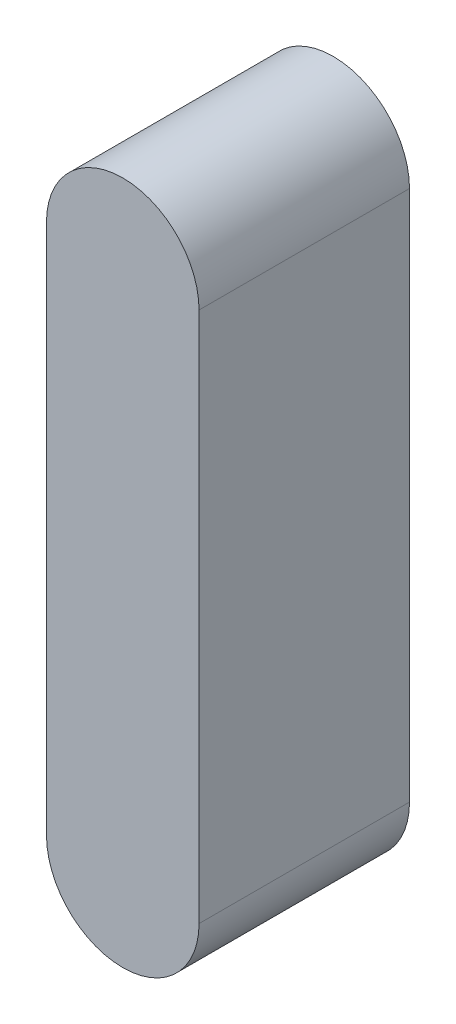
ISO-10303-21;
HEADER;
FILE_DESCRIPTION(('STEP AP214'),'2;1');
FILE_NAME('part.step','',(''),(''),'','','');
FILE_SCHEMA(('AUTOMOTIVE_DESIGN { 1 0 10303 214 1 1 1 1 }'));
ENDSEC;
DATA;
#1=APPLICATION_CONTEXT('core data for automotive mechanical design processes');
#2=APPLICATION_PROTOCOL_DEFINITION('international standard','automotive_design',2000,#1);
#3=PRODUCT_CONTEXT('',#1,'mechanical');
#4=PRODUCT('Part','Part','',(#3));
#5=PRODUCT_RELATED_PRODUCT_CATEGORY('part','',(#4));
#6=PRODUCT_DEFINITION_FORMATION('','',#4);
#7=PRODUCT_DEFINITION_CONTEXT('part definition',#1,'design');
#8=PRODUCT_DEFINITION('design','',#6,#7);
#9=PRODUCT_DEFINITION_SHAPE('','',#8);
#10=(LENGTH_UNIT() NAMED_UNIT(*) SI_UNIT(.MILLI.,.METRE.));
#11=(NAMED_UNIT(*) PLANE_ANGLE_UNIT() SI_UNIT($,.RADIAN.));
#12=(NAMED_UNIT(*) SI_UNIT($,.STERADIAN.) SOLID_ANGLE_UNIT());
#13=UNCERTAINTY_MEASURE_WITH_UNIT(LENGTH_MEASURE(1.E-05),#10,'distance_accuracy_value','');
#14=(GEOMETRIC_REPRESENTATION_CONTEXT(3) GLOBAL_UNCERTAINTY_ASSIGNED_CONTEXT((#13)) GLOBAL_UNIT_ASSIGNED_CONTEXT((#10,
#11,#12)) REPRESENTATION_CONTEXT('',''));
#15=CARTESIAN_POINT('',(0.,0.,0.));
#16=DIRECTION('',(0.,0.,1.));
#17=DIRECTION('',(1.,0.,0.));
#18=AXIS2_PLACEMENT_3D('',#15,#16,#17);
#19=CARTESIAN_POINT('',(1.45,0.,4.));
#20=DIRECTION('',(-1.,0.,0.));
#21=DIRECTION('',(0.,-1.,0.));
#22=AXIS2_PLACEMENT_3D('',#19,#20,#21);
#23=PLANE('',#22);
#24=DIRECTION('',(0.,1.,0.));
#25=VECTOR('',#24,1.);
#26=CARTESIAN_POINT('',(1.45,0.,0.));
#27=LINE('',#26,#25);
#28=CARTESIAN_POINT('',(1.45,-5.05,0.));
#29=VERTEX_POINT('',#28);
#30=CARTESIAN_POINT('',(1.45,5.05,0.));
#31=VERTEX_POINT('',#30);
#32=EDGE_CURVE('E112',#29,#31,#27,.T.);
#33=ORIENTED_EDGE('',*,*,#32,.T.);
#34=DIRECTION('',(0.,0.,-1.));
#35=VECTOR('',#34,1.);
#36=CARTESIAN_POINT('',(1.45,5.05,4.));
#37=LINE('',#36,#35);
#38=CARTESIAN_POINT('',(1.45,5.05,4.));
#39=VERTEX_POINT('',#38);
#40=EDGE_CURVE('E11',#39,#31,#37,.T.);
#41=ORIENTED_EDGE('',*,*,#40,.F.);
#42=DIRECTION('',(0.,1.,0.));
#43=VECTOR('',#42,1.);
#44=CARTESIAN_POINT('',(1.45,0.,4.));
#45=LINE('',#44,#43);
#46=CARTESIAN_POINT('',(1.45,-5.05,4.));
#47=VERTEX_POINT('',#46);
#48=EDGE_CURVE('E93',#47,#39,#45,.T.);
#49=ORIENTED_EDGE('',*,*,#48,.F.);
#50=DIRECTION('',(0.,0.,-1.));
#51=VECTOR('',#50,1.);
#52=CARTESIAN_POINT('',(1.45,-5.05,4.));
#53=LINE('',#52,#51);
#54=EDGE_CURVE('E108',#47,#29,#53,.T.);
#55=ORIENTED_EDGE('',*,*,#54,.T.);
#56=EDGE_LOOP('',(#33,#41,#49,#55));
#57=FACE_BOUND('',#56,.T.);
#58=ADVANCED_FACE('F45',(#57),#23,.F.);
#59=CARTESIAN_POINT('',(0.,5.05,4.));
#60=DIRECTION('',(0.,0.,-1.));
#61=DIRECTION('',(-1.,0.,0.));
#62=AXIS2_PLACEMENT_3D('',#59,#60,#61);
#63=CYLINDRICAL_SURFACE('',#62,1.45);
#64=CARTESIAN_POINT('',(0.,5.05,0.));
#65=DIRECTION('',(0.,0.,1.));
#66=DIRECTION('',(1.,0.,0.));
#67=AXIS2_PLACEMENT_3D('',#64,#65,#66);
#68=CIRCLE('',#67,1.45);
#69=CARTESIAN_POINT('',(-1.45,5.05,0.));
#70=VERTEX_POINT('',#69);
#71=EDGE_CURVE('E99',#31,#70,#68,.T.);
#72=ORIENTED_EDGE('',*,*,#71,.T.);
#73=DIRECTION('',(0.,0.,-1.));
#74=VECTOR('',#73,1.);
#75=CARTESIAN_POINT('',(-1.45,5.05,4.));
#76=LINE('',#75,#74);
#77=CARTESIAN_POINT('',(-1.45,5.05,4.));
#78=VERTEX_POINT('',#77);
#79=EDGE_CURVE('E54',#78,#70,#76,.T.);
#80=ORIENTED_EDGE('',*,*,#79,.F.);
#81=CARTESIAN_POINT('',(0.,5.05,4.));
#82=DIRECTION('',(0.,0.,1.));
#83=DIRECTION('',(1.,0.,0.));
#84=AXIS2_PLACEMENT_3D('',#81,#82,#83);
#85=CIRCLE('',#84,1.45);
#86=EDGE_CURVE('E88',#39,#78,#85,.T.);
#87=ORIENTED_EDGE('',*,*,#86,.F.);
#88=ORIENTED_EDGE('',*,*,#40,.T.);
#89=EDGE_LOOP('',(#72,#80,#87,#88));
#90=FACE_BOUND('',#89,.T.);
#91=ADVANCED_FACE('F98',(#90),#63,.T.);
#92=CARTESIAN_POINT('',(-1.45,0.,4.));
#93=DIRECTION('',(-1.,0.,0.));
#94=DIRECTION('',(0.,-1.,0.));
#95=AXIS2_PLACEMENT_3D('',#92,#93,#94);
#96=PLANE('',#95);
#97=DIRECTION('',(0.,1.,0.));
#98=VECTOR('',#97,1.);
#99=CARTESIAN_POINT('',(-1.45,0.,0.));
#100=LINE('',#99,#98);
#101=CARTESIAN_POINT('',(-1.45,-5.05,0.));
#102=VERTEX_POINT('',#101);
#103=EDGE_CURVE('E118',#102,#70,#100,.T.);
#104=ORIENTED_EDGE('',*,*,#103,.F.);
#105=DIRECTION('',(0.,0.,-1.));
#106=VECTOR('',#105,1.);
#107=CARTESIAN_POINT('',(-1.45,-5.05,4.));
#108=LINE('',#107,#106);
#109=CARTESIAN_POINT('',(-1.45,-5.05,4.));
#110=VERTEX_POINT('',#109);
#111=EDGE_CURVE('E78',#110,#102,#108,.T.);
#112=ORIENTED_EDGE('',*,*,#111,.F.);
#113=DIRECTION('',(0.,1.,0.));
#114=VECTOR('',#113,1.);
#115=CARTESIAN_POINT('',(-1.45,0.,4.));
#116=LINE('',#115,#114);
#117=EDGE_CURVE('E91',#110,#78,#116,.T.);
#118=ORIENTED_EDGE('',*,*,#117,.T.);
#119=ORIENTED_EDGE('',*,*,#79,.T.);
#120=EDGE_LOOP('',(#104,#112,#118,#119));
#121=FACE_BOUND('',#120,.T.);
#122=ADVANCED_FACE('F104',(#121),#96,.T.);
#123=CARTESIAN_POINT('',(0.,-5.05,4.));
#124=DIRECTION('',(0.,0.,-1.));
#125=DIRECTION('',(-1.,0.,0.));
#126=AXIS2_PLACEMENT_3D('',#123,#124,#125);
#127=CYLINDRICAL_SURFACE('',#126,1.45);
#128=CARTESIAN_POINT('',(0.,-5.05,0.));
#129=DIRECTION('',(0.,0.,1.));
#130=DIRECTION('',(1.,0.,0.));
#131=AXIS2_PLACEMENT_3D('',#128,#129,#130);
#132=CIRCLE('',#131,1.45);
#133=EDGE_CURVE('E81',#102,#29,#132,.T.);
#134=ORIENTED_EDGE('',*,*,#133,.T.);
#135=ORIENTED_EDGE('',*,*,#54,.F.);
#136=CARTESIAN_POINT('',(0.,-5.05,4.));
#137=DIRECTION('',(0.,0.,1.));
#138=DIRECTION('',(1.,0.,0.));
#139=AXIS2_PLACEMENT_3D('',#136,#137,#138);
#140=CIRCLE('',#139,1.45);
#141=EDGE_CURVE('E62',#110,#47,#140,.T.);
#142=ORIENTED_EDGE('',*,*,#141,.F.);
#143=ORIENTED_EDGE('',*,*,#111,.T.);
#144=EDGE_LOOP('',(#134,#135,#142,#143));
#145=FACE_BOUND('',#144,.T.);
#146=ADVANCED_FACE('F135',(#145),#127,.T.);
#147=CARTESIAN_POINT('',(0.,0.,4.));
#148=DIRECTION('',(0.,0.,1.));
#149=DIRECTION('',(1.,0.,0.));
#150=AXIS2_PLACEMENT_3D('',#147,#148,#149);
#151=PLANE('',#150);
#152=ORIENTED_EDGE('',*,*,#48,.T.);
#153=ORIENTED_EDGE('',*,*,#86,.T.);
#154=ORIENTED_EDGE('',*,*,#117,.F.);
#155=ORIENTED_EDGE('',*,*,#141,.T.);
#156=EDGE_LOOP('',(#152,#153,#154,#155));
#157=FACE_BOUND('',#156,.T.);
#158=ADVANCED_FACE('F89',(#157),#151,.T.);
#159=CARTESIAN_POINT('',(0.,0.,0.));
#160=DIRECTION('',(0.,0.,1.));
#161=DIRECTION('',(1.,0.,0.));
#162=AXIS2_PLACEMENT_3D('',#159,#160,#161);
#163=PLANE('',#162);
#164=ORIENTED_EDGE('',*,*,#32,.F.);
#165=ORIENTED_EDGE('',*,*,#133,.F.);
#166=ORIENTED_EDGE('',*,*,#103,.T.);
#167=ORIENTED_EDGE('',*,*,#71,.F.);
#168=EDGE_LOOP('',(#164,#165,#166,#167));
#169=FACE_BOUND('',#168,.T.);
#170=ADVANCED_FACE('F129',(#169),#163,.F.);
#171=CLOSED_SHELL('',(#58,#91,#122,#146,#158,#170));
#172=MANIFOLD_SOLID_BREP('B2',#171);
#173=ADVANCED_BREP_SHAPE_REPRESENTATION('',(#18,#172),#14);
#174=SHAPE_DEFINITION_REPRESENTATION(#9,#173);
ENDSEC;
END-ISO-10303-21;
